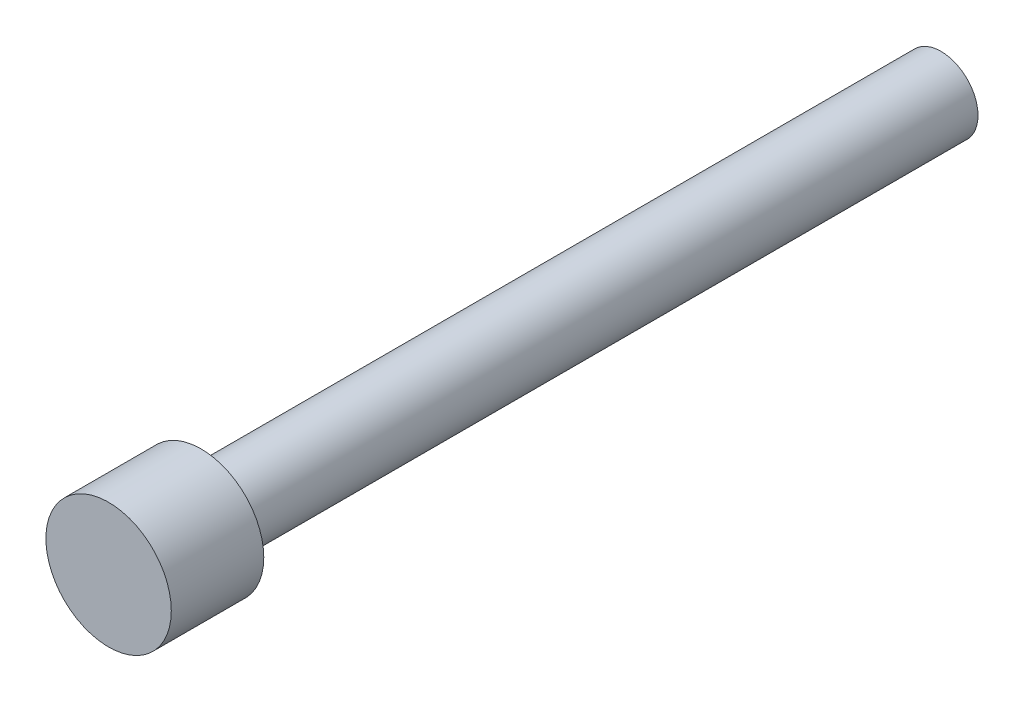
ISO-10303-21;
HEADER;
FILE_DESCRIPTION(('STEP AP214'),'2;1');
FILE_NAME('part.step','',(''),(''),'','','');
FILE_SCHEMA(('AUTOMOTIVE_DESIGN { 1 0 10303 214 1 1 1 1 }'));
ENDSEC;
DATA;
#1=APPLICATION_CONTEXT('core data for automotive mechanical design processes');
#2=APPLICATION_PROTOCOL_DEFINITION('international standard','automotive_design',2000,#1);
#3=PRODUCT_CONTEXT('',#1,'mechanical');
#4=PRODUCT('Part','Part','',(#3));
#5=PRODUCT_RELATED_PRODUCT_CATEGORY('part','',(#4));
#6=PRODUCT_DEFINITION_FORMATION('','',#4);
#7=PRODUCT_DEFINITION_CONTEXT('part definition',#1,'design');
#8=PRODUCT_DEFINITION('design','',#6,#7);
#9=PRODUCT_DEFINITION_SHAPE('','',#8);
#10=(LENGTH_UNIT() NAMED_UNIT(*) SI_UNIT(.MILLI.,.METRE.));
#11=(NAMED_UNIT(*) PLANE_ANGLE_UNIT() SI_UNIT($,.RADIAN.));
#12=(NAMED_UNIT(*) SI_UNIT($,.STERADIAN.) SOLID_ANGLE_UNIT());
#13=UNCERTAINTY_MEASURE_WITH_UNIT(LENGTH_MEASURE(1.E-05),#10,'distance_accuracy_value','');
#14=(GEOMETRIC_REPRESENTATION_CONTEXT(3) GLOBAL_UNCERTAINTY_ASSIGNED_CONTEXT((#13)) GLOBAL_UNIT_ASSIGNED_CONTEXT((#10,
#11,#12)) REPRESENTATION_CONTEXT('',''));
#15=CARTESIAN_POINT('',(0.,0.,0.));
#16=DIRECTION('',(0.,0.,1.));
#17=DIRECTION('',(1.,0.,0.));
#18=AXIS2_PLACEMENT_3D('',#15,#16,#17);
#19=CARTESIAN_POINT('',(0.,0.,40.));
#20=DIRECTION('',(0.,0.,-1.));
#21=DIRECTION('',(-1.,0.,0.));
#22=AXIS2_PLACEMENT_3D('',#19,#20,#21);
#23=CYLINDRICAL_SURFACE('',#22,2.);
#24=CARTESIAN_POINT('',(0.,0.,40.));
#25=DIRECTION('',(0.,0.,1.));
#26=DIRECTION('',(1.,0.,0.));
#27=AXIS2_PLACEMENT_3D('',#24,#25,#26);
#28=CIRCLE('',#27,2.);
#29=CARTESIAN_POINT('',(2.,0.,40.));
#30=VERTEX_POINT('',#29);
#31=EDGE_CURVE('E10',#30,#30,#28,.T.);
#32=ORIENTED_EDGE('',*,*,#31,.F.);
#33=EDGE_LOOP('',(#32));
#34=FACE_BOUND('',#33,.T.);
#35=CARTESIAN_POINT('',(0.,0.,0.));
#36=DIRECTION('',(0.,0.,1.));
#37=DIRECTION('',(1.,0.,0.));
#38=AXIS2_PLACEMENT_3D('',#35,#36,#37);
#39=CIRCLE('',#38,2.);
#40=CARTESIAN_POINT('',(2.,0.,0.));
#41=VERTEX_POINT('',#40);
#42=EDGE_CURVE('E46',#41,#41,#39,.T.);
#43=ORIENTED_EDGE('',*,*,#42,.T.);
#44=EDGE_LOOP('',(#43));
#45=FACE_BOUND('',#44,.T.);
#46=ADVANCED_FACE('F43',(#34,#45),#23,.T.);
#47=CARTESIAN_POINT('',(0.,0.,0.));
#48=DIRECTION('',(0.,0.,1.));
#49=DIRECTION('',(1.,0.,0.));
#50=AXIS2_PLACEMENT_3D('',#47,#48,#49);
#51=PLANE('',#50);
#52=ORIENTED_EDGE('',*,*,#42,.F.);
#53=EDGE_LOOP('',(#52));
#54=FACE_BOUND('',#53,.T.);
#55=ADVANCED_FACE('F70',(#54),#51,.F.);
#56=CARTESIAN_POINT('',(0.,0.,45.));
#57=DIRECTION('',(0.,0.,-1.));
#58=DIRECTION('',(-1.,0.,0.));
#59=AXIS2_PLACEMENT_3D('',#56,#57,#58);
#60=CYLINDRICAL_SURFACE('',#59,3.39);
#61=CARTESIAN_POINT('',(0.,0.,45.));
#62=DIRECTION('',(0.,0.,1.));
#63=DIRECTION('',(1.,0.,0.));
#64=AXIS2_PLACEMENT_3D('',#61,#62,#63);
#65=CIRCLE('',#64,3.39);
#66=CARTESIAN_POINT('',(3.39,0.,45.));
#67=VERTEX_POINT('',#66);
#68=EDGE_CURVE('E55',#67,#67,#65,.T.);
#69=ORIENTED_EDGE('',*,*,#68,.F.);
#70=EDGE_LOOP('',(#69));
#71=FACE_BOUND('',#70,.T.);
#72=CARTESIAN_POINT('',(0.,0.,40.));
#73=DIRECTION('',(0.,0.,1.));
#74=DIRECTION('',(1.,0.,0.));
#75=AXIS2_PLACEMENT_3D('',#72,#73,#74);
#76=CIRCLE('',#75,3.39);
#77=CARTESIAN_POINT('',(3.39,0.,40.));
#78=VERTEX_POINT('',#77);
#79=EDGE_CURVE('E57',#78,#78,#76,.T.);
#80=ORIENTED_EDGE('',*,*,#79,.T.);
#81=EDGE_LOOP('',(#80));
#82=FACE_BOUND('',#81,.T.);
#83=ADVANCED_FACE('F67',(#71,#82),#60,.T.);
#84=CARTESIAN_POINT('',(0.,0.,45.));
#85=DIRECTION('',(0.,0.,1.));
#86=DIRECTION('',(1.,0.,0.));
#87=AXIS2_PLACEMENT_3D('',#84,#85,#86);
#88=PLANE('',#87);
#89=ORIENTED_EDGE('',*,*,#68,.T.);
#90=EDGE_LOOP('',(#89));
#91=FACE_BOUND('',#90,.T.);
#92=ADVANCED_FACE('F65',(#91),#88,.T.);
#93=CARTESIAN_POINT('',(0.,0.,40.));
#94=DIRECTION('',(0.,0.,1.));
#95=DIRECTION('',(1.,0.,0.));
#96=AXIS2_PLACEMENT_3D('',#93,#94,#95);
#97=PLANE('',#96);
#98=ORIENTED_EDGE('',*,*,#31,.T.);
#99=EDGE_LOOP('',(#98));
#100=FACE_BOUND('',#99,.T.);
#101=ORIENTED_EDGE('',*,*,#79,.F.);
#102=EDGE_LOOP('',(#101));
#103=FACE_BOUND('',#102,.T.);
#104=ADVANCED_FACE('F74',(#100,#103),#97,.F.);
#105=CLOSED_SHELL('',(#46,#55,#83,#92,#104));
#106=MANIFOLD_SOLID_BREP('B2',#105);
#107=ADVANCED_BREP_SHAPE_REPRESENTATION('',(#18,#106),#14);
#108=SHAPE_DEFINITION_REPRESENTATION(#9,#107);
ENDSEC;
END-ISO-10303-21;
